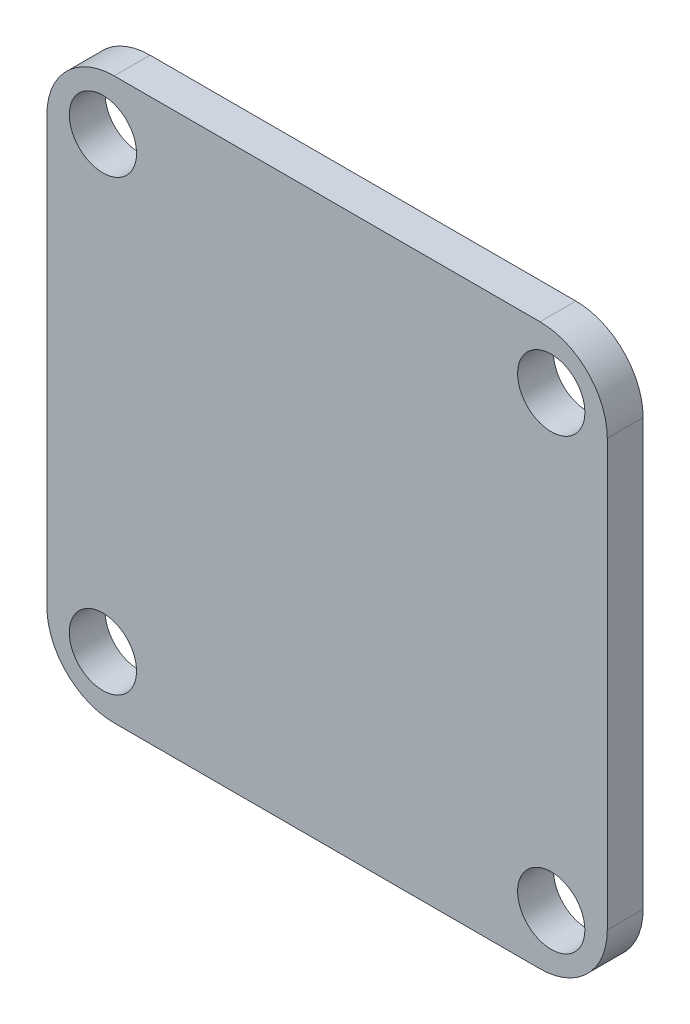
ISO-10303-21;
HEADER;
FILE_DESCRIPTION(('STEP AP214'),'2;1');
FILE_NAME('part.step','',(''),(''),'','','');
FILE_SCHEMA(('AUTOMOTIVE_DESIGN { 1 0 10303 214 1 1 1 1 }'));
ENDSEC;
DATA;
#1=APPLICATION_CONTEXT('core data for automotive mechanical design processes');
#2=APPLICATION_PROTOCOL_DEFINITION('international standard','automotive_design',2000,#1);
#3=PRODUCT_CONTEXT('',#1,'mechanical');
#4=PRODUCT('Part','Part','',(#3));
#5=PRODUCT_RELATED_PRODUCT_CATEGORY('part','',(#4));
#6=PRODUCT_DEFINITION_FORMATION('','',#4);
#7=PRODUCT_DEFINITION_CONTEXT('part definition',#1,'design');
#8=PRODUCT_DEFINITION('design','',#6,#7);
#9=PRODUCT_DEFINITION_SHAPE('','',#8);
#10=(LENGTH_UNIT() NAMED_UNIT(*) SI_UNIT(.MILLI.,.METRE.));
#11=(NAMED_UNIT(*) PLANE_ANGLE_UNIT() SI_UNIT($,.RADIAN.));
#12=(NAMED_UNIT(*) SI_UNIT($,.STERADIAN.) SOLID_ANGLE_UNIT());
#13=UNCERTAINTY_MEASURE_WITH_UNIT(LENGTH_MEASURE(1.E-05),#10,'distance_accuracy_value','');
#14=(GEOMETRIC_REPRESENTATION_CONTEXT(3) GLOBAL_UNCERTAINTY_ASSIGNED_CONTEXT((#13)) GLOBAL_UNIT_ASSIGNED_CONTEXT((#10,
#11,#12)) REPRESENTATION_CONTEXT('',''));
#15=CARTESIAN_POINT('',(0.,0.,0.));
#16=DIRECTION('',(0.,0.,1.));
#17=DIRECTION('',(1.,0.,0.));
#18=AXIS2_PLACEMENT_3D('',#15,#16,#17);
#19=CARTESIAN_POINT('',(-9.50000000000001,-9.50000000000001,1.6));
#20=DIRECTION('',(0.,0.,-1.));
#21=DIRECTION('',(-1.,0.,0.));
#22=AXIS2_PLACEMENT_3D('',#19,#20,#21);
#23=PLANE('',#22);
#24=CARTESIAN_POINT('',(-9.50000000000001,-9.50000000000001,1.6));
#25=DIRECTION('',(0.,0.,1.));
#26=DIRECTION('',(-1.,0.,0.));
#27=AXIS2_PLACEMENT_3D('',#24,#25,#26);
#28=CIRCLE('',#27,3.);
#29=CARTESIAN_POINT('',(-12.5,-9.49999999999998,1.6));
#30=VERTEX_POINT('',#29);
#31=CARTESIAN_POINT('',(-9.49999999999998,-12.5,1.6));
#32=VERTEX_POINT('',#31);
#33=EDGE_CURVE('E145',#30,#32,#28,.T.);
#34=ORIENTED_EDGE('',*,*,#33,.T.);
#35=DIRECTION('',(1.,0.,0.));
#36=VECTOR('',#35,1.);
#37=CARTESIAN_POINT('',(-9.49999999999998,-12.5,1.6));
#38=LINE('',#37,#36);
#39=CARTESIAN_POINT('',(9.49999999999997,-12.5,1.6));
#40=VERTEX_POINT('',#39);
#41=EDGE_CURVE('E93',#32,#40,#38,.T.);
#42=ORIENTED_EDGE('',*,*,#41,.T.);
#43=CARTESIAN_POINT('',(9.49999999999999,-9.50000000000001,1.6));
#44=DIRECTION('',(0.,0.,1.));
#45=DIRECTION('',(1.,0.,0.));
#46=AXIS2_PLACEMENT_3D('',#43,#44,#45);
#47=CIRCLE('',#46,3.);
#48=CARTESIAN_POINT('',(12.5,-9.50000000000001,1.6));
#49=VERTEX_POINT('',#48);
#50=EDGE_CURVE('E160',#40,#49,#47,.T.);
#51=ORIENTED_EDGE('',*,*,#50,.T.);
#52=DIRECTION('',(0.,1.,0.));
#53=VECTOR('',#52,1.);
#54=CARTESIAN_POINT('',(12.5,-9.49999999999998,1.6));
#55=LINE('',#54,#53);
#56=CARTESIAN_POINT('',(12.5,9.49999999999998,1.6));
#57=VERTEX_POINT('',#56);
#58=EDGE_CURVE('E173',#49,#57,#55,.T.);
#59=ORIENTED_EDGE('',*,*,#58,.T.);
#60=CARTESIAN_POINT('',(9.49999999999999,9.5,1.6));
#61=DIRECTION('',(0.,0.,1.));
#62=DIRECTION('',(-1.,0.,0.));
#63=AXIS2_PLACEMENT_3D('',#60,#61,#62);
#64=CIRCLE('',#63,3.);
#65=CARTESIAN_POINT('',(9.49999999999997,12.5,1.6));
#66=VERTEX_POINT('',#65);
#67=EDGE_CURVE('E112',#57,#66,#64,.T.);
#68=ORIENTED_EDGE('',*,*,#67,.T.);
#69=DIRECTION('',(-1.,0.,0.));
#70=VECTOR('',#69,1.);
#71=CARTESIAN_POINT('',(-9.49999999999998,12.5,1.6));
#72=LINE('',#71,#70);
#73=CARTESIAN_POINT('',(-9.49999999999998,12.5,1.6));
#74=VERTEX_POINT('',#73);
#75=EDGE_CURVE('E106',#66,#74,#72,.T.);
#76=ORIENTED_EDGE('',*,*,#75,.T.);
#77=CARTESIAN_POINT('',(-9.50000000000001,9.5,1.6));
#78=DIRECTION('',(0.,0.,1.));
#79=DIRECTION('',(-1.,0.,0.));
#80=AXIS2_PLACEMENT_3D('',#77,#78,#79);
#81=CIRCLE('',#80,3.);
#82=CARTESIAN_POINT('',(-12.5,9.49999999999998,1.6));
#83=VERTEX_POINT('',#82);
#84=EDGE_CURVE('E110',#74,#83,#81,.T.);
#85=ORIENTED_EDGE('',*,*,#84,.T.);
#86=DIRECTION('',(0.,-1.,0.));
#87=VECTOR('',#86,1.);
#88=CARTESIAN_POINT('',(-12.5,-9.49999999999998,1.6));
#89=LINE('',#88,#87);
#90=EDGE_CURVE('E50',#83,#30,#89,.T.);
#91=ORIENTED_EDGE('',*,*,#90,.T.);
#92=EDGE_LOOP('',(#34,#42,#51,#59,#68,#76,#85,#91));
#93=FACE_BOUND('',#92,.T.);
#94=CARTESIAN_POINT('',(-10.,9.99999999999999,1.6));
#95=DIRECTION('',(0.,0.,1.));
#96=DIRECTION('',(1.,0.,0.));
#97=AXIS2_PLACEMENT_3D('',#94,#95,#96);
#98=CIRCLE('',#97,1.5);
#99=CARTESIAN_POINT('',(-8.5,9.99999999999999,1.6));
#100=VERTEX_POINT('',#99);
#101=EDGE_CURVE('E134',#100,#100,#98,.T.);
#102=ORIENTED_EDGE('',*,*,#101,.F.);
#103=EDGE_LOOP('',(#102));
#104=FACE_BOUND('',#103,.T.);
#105=CARTESIAN_POINT('',(9.99999999999999,9.99999999999999,1.6));
#106=DIRECTION('',(0.,0.,1.));
#107=DIRECTION('',(-1.,0.,0.));
#108=AXIS2_PLACEMENT_3D('',#105,#106,#107);
#109=CIRCLE('',#108,1.5);
#110=CARTESIAN_POINT('',(8.49999999999999,9.99999999999999,1.6));
#111=VERTEX_POINT('',#110);
#112=EDGE_CURVE('E182',#111,#111,#109,.T.);
#113=ORIENTED_EDGE('',*,*,#112,.F.);
#114=EDGE_LOOP('',(#113));
#115=FACE_BOUND('',#114,.T.);
#116=CARTESIAN_POINT('',(9.99999999999998,-10.,1.6));
#117=DIRECTION('',(0.,0.,1.));
#118=DIRECTION('',(1.,0.,0.));
#119=AXIS2_PLACEMENT_3D('',#116,#117,#118);
#120=CIRCLE('',#119,1.5);
#121=CARTESIAN_POINT('',(11.5,-10.,1.6));
#122=VERTEX_POINT('',#121);
#123=EDGE_CURVE('E188',#122,#122,#120,.T.);
#124=ORIENTED_EDGE('',*,*,#123,.F.);
#125=EDGE_LOOP('',(#124));
#126=FACE_BOUND('',#125,.T.);
#127=CARTESIAN_POINT('',(-10.,-10.,1.6));
#128=DIRECTION('',(0.,0.,1.));
#129=DIRECTION('',(-1.,0.,0.));
#130=AXIS2_PLACEMENT_3D('',#127,#128,#129);
#131=CIRCLE('',#130,1.5);
#132=CARTESIAN_POINT('',(-11.5,-10.,1.6));
#133=VERTEX_POINT('',#132);
#134=EDGE_CURVE('E194',#133,#133,#131,.T.);
#135=ORIENTED_EDGE('',*,*,#134,.F.);
#136=EDGE_LOOP('',(#135));
#137=FACE_BOUND('',#136,.T.);
#138=ADVANCED_FACE('F33',(#93,#104,#115,#126,#137),#23,.F.);
#139=CARTESIAN_POINT('',(-9.50000000000001,-9.50000000000001,0.));
#140=DIRECTION('',(0.,0.,-1.));
#141=DIRECTION('',(-1.,0.,0.));
#142=AXIS2_PLACEMENT_3D('',#139,#140,#141);
#143=PLANE('',#142);
#144=CARTESIAN_POINT('',(9.99999999999998,-10.,0.));
#145=DIRECTION('',(0.,0.,1.));
#146=DIRECTION('',(1.,0.,0.));
#147=AXIS2_PLACEMENT_3D('',#144,#145,#146);
#148=CIRCLE('',#147,1.5);
#149=CARTESIAN_POINT('',(11.5,-10.,0.));
#150=VERTEX_POINT('',#149);
#151=EDGE_CURVE('E191',#150,#150,#148,.T.);
#152=ORIENTED_EDGE('',*,*,#151,.T.);
#153=EDGE_LOOP('',(#152));
#154=FACE_BOUND('',#153,.T.);
#155=CARTESIAN_POINT('',(-10.,9.99999999999999,0.));
#156=DIRECTION('',(0.,0.,1.));
#157=DIRECTION('',(1.,0.,0.));
#158=AXIS2_PLACEMENT_3D('',#155,#156,#157);
#159=CIRCLE('',#158,1.5);
#160=CARTESIAN_POINT('',(-8.5,9.99999999999999,0.));
#161=VERTEX_POINT('',#160);
#162=EDGE_CURVE('E179',#161,#161,#159,.T.);
#163=ORIENTED_EDGE('',*,*,#162,.T.);
#164=EDGE_LOOP('',(#163));
#165=FACE_BOUND('',#164,.T.);
#166=CARTESIAN_POINT('',(-9.50000000000001,-9.50000000000001,0.));
#167=DIRECTION('',(0.,0.,1.));
#168=DIRECTION('',(-1.,0.,0.));
#169=AXIS2_PLACEMENT_3D('',#166,#167,#168);
#170=CIRCLE('',#169,3.);
#171=CARTESIAN_POINT('',(-12.5,-9.49999999999998,0.));
#172=VERTEX_POINT('',#171);
#173=CARTESIAN_POINT('',(-9.49999999999998,-12.5,0.));
#174=VERTEX_POINT('',#173);
#175=EDGE_CURVE('E130',#172,#174,#170,.T.);
#176=ORIENTED_EDGE('',*,*,#175,.F.);
#177=DIRECTION('',(0.,-1.,0.));
#178=VECTOR('',#177,1.);
#179=CARTESIAN_POINT('',(-12.5,-9.49999999999998,0.));
#180=LINE('',#179,#178);
#181=CARTESIAN_POINT('',(-12.5,9.49999999999998,0.));
#182=VERTEX_POINT('',#181);
#183=EDGE_CURVE('E85',#182,#172,#180,.T.);
#184=ORIENTED_EDGE('',*,*,#183,.F.);
#185=CARTESIAN_POINT('',(-9.50000000000001,9.5,0.));
#186=DIRECTION('',(0.,0.,1.));
#187=DIRECTION('',(-1.,0.,0.));
#188=AXIS2_PLACEMENT_3D('',#185,#186,#187);
#189=CIRCLE('',#188,3.);
#190=CARTESIAN_POINT('',(-9.49999999999998,12.5,0.));
#191=VERTEX_POINT('',#190);
#192=EDGE_CURVE('E79',#191,#182,#189,.T.);
#193=ORIENTED_EDGE('',*,*,#192,.F.);
#194=DIRECTION('',(-1.,0.,0.));
#195=VECTOR('',#194,1.);
#196=CARTESIAN_POINT('',(-9.49999999999998,12.5,0.));
#197=LINE('',#196,#195);
#198=CARTESIAN_POINT('',(9.49999999999997,12.5,0.));
#199=VERTEX_POINT('',#198);
#200=EDGE_CURVE('E120',#199,#191,#197,.T.);
#201=ORIENTED_EDGE('',*,*,#200,.F.);
#202=CARTESIAN_POINT('',(9.49999999999999,9.5,0.));
#203=DIRECTION('',(0.,0.,1.));
#204=DIRECTION('',(-1.,0.,0.));
#205=AXIS2_PLACEMENT_3D('',#202,#203,#204);
#206=CIRCLE('',#205,3.);
#207=CARTESIAN_POINT('',(12.5,9.49999999999998,0.));
#208=VERTEX_POINT('',#207);
#209=EDGE_CURVE('E140',#208,#199,#206,.T.);
#210=ORIENTED_EDGE('',*,*,#209,.F.);
#211=DIRECTION('',(0.,1.,0.));
#212=VECTOR('',#211,1.);
#213=CARTESIAN_POINT('',(12.5,-9.49999999999998,0.));
#214=LINE('',#213,#212);
#215=CARTESIAN_POINT('',(12.5,-9.50000000000001,0.));
#216=VERTEX_POINT('',#215);
#217=EDGE_CURVE('E138',#216,#208,#214,.T.);
#218=ORIENTED_EDGE('',*,*,#217,.F.);
#219=CARTESIAN_POINT('',(9.49999999999999,-9.50000000000001,0.));
#220=DIRECTION('',(0.,0.,1.));
#221=DIRECTION('',(1.,0.,0.));
#222=AXIS2_PLACEMENT_3D('',#219,#220,#221);
#223=CIRCLE('',#222,3.);
#224=CARTESIAN_POINT('',(9.49999999999997,-12.5,0.));
#225=VERTEX_POINT('',#224);
#226=EDGE_CURVE('E136',#225,#216,#223,.T.);
#227=ORIENTED_EDGE('',*,*,#226,.F.);
#228=DIRECTION('',(1.,0.,0.));
#229=VECTOR('',#228,1.);
#230=CARTESIAN_POINT('',(-9.49999999999998,-12.5,0.));
#231=LINE('',#230,#229);
#232=EDGE_CURVE('E133',#174,#225,#231,.T.);
#233=ORIENTED_EDGE('',*,*,#232,.F.);
#234=EDGE_LOOP('',(#176,#184,#193,#201,#210,#218,#227,#233));
#235=FACE_BOUND('',#234,.T.);
#236=CARTESIAN_POINT('',(9.99999999999999,9.99999999999999,0.));
#237=DIRECTION('',(0.,0.,1.));
#238=DIRECTION('',(-1.,0.,0.));
#239=AXIS2_PLACEMENT_3D('',#236,#237,#238);
#240=CIRCLE('',#239,1.5);
#241=CARTESIAN_POINT('',(8.49999999999999,9.99999999999999,0.));
#242=VERTEX_POINT('',#241);
#243=EDGE_CURVE('E185',#242,#242,#240,.T.);
#244=ORIENTED_EDGE('',*,*,#243,.T.);
#245=EDGE_LOOP('',(#244));
#246=FACE_BOUND('',#245,.T.);
#247=CARTESIAN_POINT('',(-10.,-10.,0.));
#248=DIRECTION('',(0.,0.,1.));
#249=DIRECTION('',(-1.,0.,0.));
#250=AXIS2_PLACEMENT_3D('',#247,#248,#249);
#251=CIRCLE('',#250,1.5);
#252=CARTESIAN_POINT('',(-11.5,-10.,0.));
#253=VERTEX_POINT('',#252);
#254=EDGE_CURVE('E197',#253,#253,#251,.T.);
#255=ORIENTED_EDGE('',*,*,#254,.T.);
#256=EDGE_LOOP('',(#255));
#257=FACE_BOUND('',#256,.T.);
#258=ADVANCED_FACE('F164',(#154,#165,#235,#246,#257),#143,.T.);
#259=CARTESIAN_POINT('',(-9.50000000000001,-9.50000000000001,1.6));
#260=DIRECTION('',(0.,0.,-1.));
#261=DIRECTION('',(-1.,0.,0.));
#262=AXIS2_PLACEMENT_3D('',#259,#260,#261);
#263=CYLINDRICAL_SURFACE('',#262,3.);
#264=ORIENTED_EDGE('',*,*,#175,.T.);
#265=DIRECTION('',(0.,0.,-1.));
#266=VECTOR('',#265,1.);
#267=CARTESIAN_POINT('',(-9.49999999999998,-12.5,1.6));
#268=LINE('',#267,#266);
#269=EDGE_CURVE('E11',#32,#174,#268,.T.);
#270=ORIENTED_EDGE('',*,*,#269,.F.);
#271=ORIENTED_EDGE('',*,*,#33,.F.);
#272=DIRECTION('',(0.,0.,-1.));
#273=VECTOR('',#272,1.);
#274=CARTESIAN_POINT('',(-12.5,-9.49999999999998,1.6));
#275=LINE('',#274,#273);
#276=EDGE_CURVE('E126',#30,#172,#275,.T.);
#277=ORIENTED_EDGE('',*,*,#276,.T.);
#278=EDGE_LOOP('',(#264,#270,#271,#277));
#279=FACE_BOUND('',#278,.T.);
#280=ADVANCED_FACE('F35',(#279),#263,.T.);
#281=CARTESIAN_POINT('',(-9.49999999999998,-12.5,1.6));
#282=DIRECTION('',(0.,1.,0.));
#283=DIRECTION('',(0.,0.,1.));
#284=AXIS2_PLACEMENT_3D('',#281,#282,#283);
#285=PLANE('',#284);
#286=ORIENTED_EDGE('',*,*,#232,.T.);
#287=DIRECTION('',(0.,0.,-1.));
#288=VECTOR('',#287,1.);
#289=CARTESIAN_POINT('',(9.49999999999997,-12.5,1.6));
#290=LINE('',#289,#288);
#291=EDGE_CURVE('E42',#40,#225,#290,.T.);
#292=ORIENTED_EDGE('',*,*,#291,.F.);
#293=ORIENTED_EDGE('',*,*,#41,.F.);
#294=ORIENTED_EDGE('',*,*,#269,.T.);
#295=EDGE_LOOP('',(#286,#292,#293,#294));
#296=FACE_BOUND('',#295,.T.);
#297=ADVANCED_FACE('F229',(#296),#285,.F.);
#298=CARTESIAN_POINT('',(9.49999999999999,-9.50000000000001,1.6));
#299=DIRECTION('',(0.,0.,-1.));
#300=DIRECTION('',(-1.,0.,0.));
#301=AXIS2_PLACEMENT_3D('',#298,#299,#300);
#302=CYLINDRICAL_SURFACE('',#301,3.);
#303=ORIENTED_EDGE('',*,*,#226,.T.);
#304=DIRECTION('',(0.,0.,-1.));
#305=VECTOR('',#304,1.);
#306=CARTESIAN_POINT('',(12.5,-9.50000000000001,1.6));
#307=LINE('',#306,#305);
#308=EDGE_CURVE('E152',#49,#216,#307,.T.);
#309=ORIENTED_EDGE('',*,*,#308,.F.);
#310=ORIENTED_EDGE('',*,*,#50,.F.);
#311=ORIENTED_EDGE('',*,*,#291,.T.);
#312=EDGE_LOOP('',(#303,#309,#310,#311));
#313=FACE_BOUND('',#312,.T.);
#314=ADVANCED_FACE('F158',(#313),#302,.T.);
#315=CARTESIAN_POINT('',(12.5,-9.49999999999998,1.6));
#316=DIRECTION('',(-1.,0.,0.));
#317=DIRECTION('',(0.,0.,1.));
#318=AXIS2_PLACEMENT_3D('',#315,#316,#317);
#319=PLANE('',#318);
#320=ORIENTED_EDGE('',*,*,#217,.T.);
#321=DIRECTION('',(0.,0.,-1.));
#322=VECTOR('',#321,1.);
#323=CARTESIAN_POINT('',(12.5,9.49999999999998,1.6));
#324=LINE('',#323,#322);
#325=EDGE_CURVE('E149',#57,#208,#324,.T.);
#326=ORIENTED_EDGE('',*,*,#325,.F.);
#327=ORIENTED_EDGE('',*,*,#58,.F.);
#328=ORIENTED_EDGE('',*,*,#308,.T.);
#329=EDGE_LOOP('',(#320,#326,#327,#328));
#330=FACE_BOUND('',#329,.T.);
#331=ADVANCED_FACE('F169',(#330),#319,.F.);
#332=CARTESIAN_POINT('',(9.49999999999999,9.5,1.6));
#333=DIRECTION('',(0.,0.,-1.));
#334=DIRECTION('',(-1.,0.,0.));
#335=AXIS2_PLACEMENT_3D('',#332,#333,#334);
#336=CYLINDRICAL_SURFACE('',#335,3.);
#337=ORIENTED_EDGE('',*,*,#209,.T.);
#338=DIRECTION('',(0.,0.,-1.));
#339=VECTOR('',#338,1.);
#340=CARTESIAN_POINT('',(9.49999999999997,12.5,1.6));
#341=LINE('',#340,#339);
#342=EDGE_CURVE('E121',#66,#199,#341,.T.);
#343=ORIENTED_EDGE('',*,*,#342,.F.);
#344=ORIENTED_EDGE('',*,*,#67,.F.);
#345=ORIENTED_EDGE('',*,*,#325,.T.);
#346=EDGE_LOOP('',(#337,#343,#344,#345));
#347=FACE_BOUND('',#346,.T.);
#348=ADVANCED_FACE('F172',(#347),#336,.T.);
#349=CARTESIAN_POINT('',(-9.49999999999998,12.5,1.6));
#350=DIRECTION('',(0.,-1.,0.));
#351=DIRECTION('',(0.,0.,-1.));
#352=AXIS2_PLACEMENT_3D('',#349,#350,#351);
#353=PLANE('',#352);
#354=ORIENTED_EDGE('',*,*,#200,.T.);
#355=DIRECTION('',(0.,0.,-1.));
#356=VECTOR('',#355,1.);
#357=CARTESIAN_POINT('',(-9.49999999999998,12.5,1.6));
#358=LINE('',#357,#356);
#359=EDGE_CURVE('E117',#74,#191,#358,.T.);
#360=ORIENTED_EDGE('',*,*,#359,.F.);
#361=ORIENTED_EDGE('',*,*,#75,.F.);
#362=ORIENTED_EDGE('',*,*,#342,.T.);
#363=EDGE_LOOP('',(#354,#360,#361,#362));
#364=FACE_BOUND('',#363,.T.);
#365=ADVANCED_FACE('F118',(#364),#353,.F.);
#366=CARTESIAN_POINT('',(-9.50000000000001,9.5,1.6));
#367=DIRECTION('',(0.,0.,-1.));
#368=DIRECTION('',(-1.,0.,0.));
#369=AXIS2_PLACEMENT_3D('',#366,#367,#368);
#370=CYLINDRICAL_SURFACE('',#369,3.);
#371=ORIENTED_EDGE('',*,*,#192,.T.);
#372=DIRECTION('',(0.,0.,-1.));
#373=VECTOR('',#372,1.);
#374=CARTESIAN_POINT('',(-12.5,9.49999999999998,1.6));
#375=LINE('',#374,#373);
#376=EDGE_CURVE('E122',#83,#182,#375,.T.);
#377=ORIENTED_EDGE('',*,*,#376,.F.);
#378=ORIENTED_EDGE('',*,*,#84,.F.);
#379=ORIENTED_EDGE('',*,*,#359,.T.);
#380=EDGE_LOOP('',(#371,#377,#378,#379));
#381=FACE_BOUND('',#380,.T.);
#382=ADVANCED_FACE('F124',(#381),#370,.T.);
#383=CARTESIAN_POINT('',(-12.5,-9.49999999999998,1.6));
#384=DIRECTION('',(1.,0.,0.));
#385=DIRECTION('',(0.,0.,-1.));
#386=AXIS2_PLACEMENT_3D('',#383,#384,#385);
#387=PLANE('',#386);
#388=ORIENTED_EDGE('',*,*,#183,.T.);
#389=ORIENTED_EDGE('',*,*,#276,.F.);
#390=ORIENTED_EDGE('',*,*,#90,.F.);
#391=ORIENTED_EDGE('',*,*,#376,.T.);
#392=EDGE_LOOP('',(#388,#389,#390,#391));
#393=FACE_BOUND('',#392,.T.);
#394=ADVANCED_FACE('F217',(#393),#387,.F.);
#395=CARTESIAN_POINT('',(-10.,9.99999999999999,1.6));
#396=DIRECTION('',(0.,0.,-1.));
#397=DIRECTION('',(-1.,0.,0.));
#398=AXIS2_PLACEMENT_3D('',#395,#396,#397);
#399=CYLINDRICAL_SURFACE('',#398,1.5);
#400=ORIENTED_EDGE('',*,*,#101,.T.);
#401=EDGE_LOOP('',(#400));
#402=FACE_BOUND('',#401,.T.);
#403=ORIENTED_EDGE('',*,*,#162,.F.);
#404=EDGE_LOOP('',(#403));
#405=FACE_BOUND('',#404,.T.);
#406=ADVANCED_FACE('F214',(#402,#405),#399,.F.);
#407=CARTESIAN_POINT('',(9.99999999999999,9.99999999999999,1.6));
#408=DIRECTION('',(0.,0.,-1.));
#409=DIRECTION('',(-1.,0.,0.));
#410=AXIS2_PLACEMENT_3D('',#407,#408,#409);
#411=CYLINDRICAL_SURFACE('',#410,1.5);
#412=ORIENTED_EDGE('',*,*,#112,.T.);
#413=EDGE_LOOP('',(#412));
#414=FACE_BOUND('',#413,.T.);
#415=ORIENTED_EDGE('',*,*,#243,.F.);
#416=EDGE_LOOP('',(#415));
#417=FACE_BOUND('',#416,.T.);
#418=ADVANCED_FACE('F293',(#414,#417),#411,.F.);
#419=CARTESIAN_POINT('',(9.99999999999998,-10.,1.6));
#420=DIRECTION('',(0.,0.,-1.));
#421=DIRECTION('',(-1.,0.,0.));
#422=AXIS2_PLACEMENT_3D('',#419,#420,#421);
#423=CYLINDRICAL_SURFACE('',#422,1.5);
#424=ORIENTED_EDGE('',*,*,#123,.T.);
#425=EDGE_LOOP('',(#424));
#426=FACE_BOUND('',#425,.T.);
#427=ORIENTED_EDGE('',*,*,#151,.F.);
#428=EDGE_LOOP('',(#427));
#429=FACE_BOUND('',#428,.T.);
#430=ADVANCED_FACE('F301',(#426,#429),#423,.F.);
#431=CARTESIAN_POINT('',(-10.,-10.,1.6));
#432=DIRECTION('',(0.,0.,-1.));
#433=DIRECTION('',(-1.,0.,0.));
#434=AXIS2_PLACEMENT_3D('',#431,#432,#433);
#435=CYLINDRICAL_SURFACE('',#434,1.5);
#436=ORIENTED_EDGE('',*,*,#134,.T.);
#437=EDGE_LOOP('',(#436));
#438=FACE_BOUND('',#437,.T.);
#439=ORIENTED_EDGE('',*,*,#254,.F.);
#440=EDGE_LOOP('',(#439));
#441=FACE_BOUND('',#440,.T.);
#442=ADVANCED_FACE('F203',(#438,#441),#435,.F.);
#443=CLOSED_SHELL('',(#138,#258,#280,#297,#314,#331,#348,#365,#382,#394,#406,#418,#430,#442));
#444=MANIFOLD_SOLID_BREP('B2',#443);
#445=ADVANCED_BREP_SHAPE_REPRESENTATION('',(#18,#444),#14);
#446=SHAPE_DEFINITION_REPRESENTATION(#9,#445);
ENDSEC;
END-ISO-10303-21;
